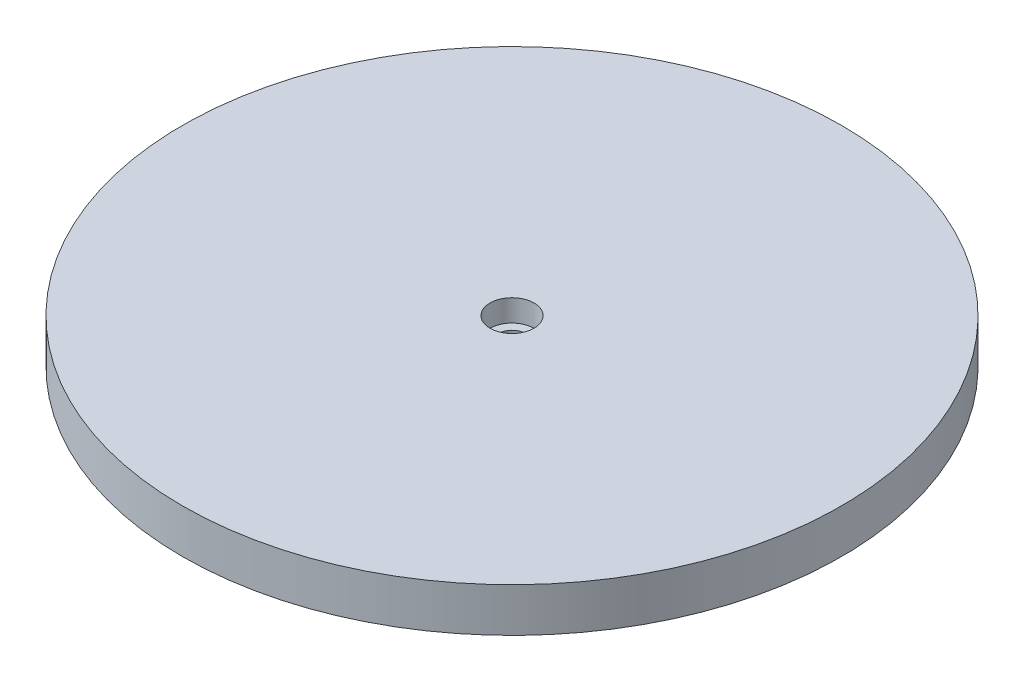
ISO-10303-21;
HEADER;
FILE_DESCRIPTION(('STEP AP214'),'2;1');
FILE_NAME('part.step','',(''),(''),'','','');
FILE_SCHEMA(('AUTOMOTIVE_DESIGN { 1 0 10303 214 1 1 1 1 }'));
ENDSEC;
DATA;
#1=APPLICATION_CONTEXT('core data for automotive mechanical design processes');
#2=APPLICATION_PROTOCOL_DEFINITION('international standard','automotive_design',2000,#1);
#3=PRODUCT_CONTEXT('',#1,'mechanical');
#4=PRODUCT('Part','Part','',(#3));
#5=PRODUCT_RELATED_PRODUCT_CATEGORY('part','',(#4));
#6=PRODUCT_DEFINITION_FORMATION('','',#4);
#7=PRODUCT_DEFINITION_CONTEXT('part definition',#1,'design');
#8=PRODUCT_DEFINITION('design','',#6,#7);
#9=PRODUCT_DEFINITION_SHAPE('','',#8);
#10=(LENGTH_UNIT() NAMED_UNIT(*) SI_UNIT(.MILLI.,.METRE.));
#11=(NAMED_UNIT(*) PLANE_ANGLE_UNIT() SI_UNIT($,.RADIAN.));
#12=(NAMED_UNIT(*) SI_UNIT($,.STERADIAN.) SOLID_ANGLE_UNIT());
#13=UNCERTAINTY_MEASURE_WITH_UNIT(LENGTH_MEASURE(1.E-05),#10,'distance_accuracy_value','');
#14=(GEOMETRIC_REPRESENTATION_CONTEXT(3) GLOBAL_UNCERTAINTY_ASSIGNED_CONTEXT((#13)) GLOBAL_UNIT_ASSIGNED_CONTEXT((#10,
#11,#12)) REPRESENTATION_CONTEXT('',''));
#15=CARTESIAN_POINT('',(0.,0.,0.));
#16=DIRECTION('',(0.,0.,1.));
#17=DIRECTION('',(1.,0.,0.));
#18=AXIS2_PLACEMENT_3D('',#15,#16,#17);
#19=CARTESIAN_POINT('',(0.,0.,0.));
#20=DIRECTION('',(0.,1.,0.));
#21=DIRECTION('',(0.,0.,1.));
#22=AXIS2_PLACEMENT_3D('',#19,#20,#21);
#23=CYLINDRICAL_SURFACE('',#22,0.6);
#24=CARTESIAN_POINT('',(0.,0.,0.));
#25=DIRECTION('',(0.,1.,0.));
#26=DIRECTION('',(0.,0.,1.));
#27=AXIS2_PLACEMENT_3D('',#24,#25,#26);
#28=CIRCLE('',#27,0.6);
#29=CARTESIAN_POINT('',(0.,0.,0.6));
#30=VERTEX_POINT('',#29);
#31=EDGE_CURVE('E50',#30,#30,#28,.T.);
#32=ORIENTED_EDGE('',*,*,#31,.F.);
#33=EDGE_LOOP('',(#32));
#34=FACE_BOUND('',#33,.T.);
#35=CARTESIAN_POINT('',(0.,1.,0.));
#36=DIRECTION('',(0.,1.,0.));
#37=DIRECTION('',(0.,0.,1.));
#38=AXIS2_PLACEMENT_3D('',#35,#36,#37);
#39=CIRCLE('',#38,0.6);
#40=CARTESIAN_POINT('',(0.,1.,0.6));
#41=VERTEX_POINT('',#40);
#42=EDGE_CURVE('E41',#41,#41,#39,.F.);
#43=ORIENTED_EDGE('',*,*,#42,.F.);
#44=EDGE_LOOP('',(#43));
#45=FACE_BOUND('',#44,.T.);
#46=ADVANCED_FACE('F37',(#34,#45),#23,.F.);
#47=CARTESIAN_POINT('',(0.,2.,0.));
#48=DIRECTION('',(0.,-1.,0.));
#49=DIRECTION('',(0.,0.,-1.));
#50=AXIS2_PLACEMENT_3D('',#47,#48,#49);
#51=CYLINDRICAL_SURFACE('',#50,15.);
#52=CARTESIAN_POINT('',(0.,2.,0.));
#53=DIRECTION('',(0.,1.,0.));
#54=DIRECTION('',(0.,0.,1.));
#55=AXIS2_PLACEMENT_3D('',#52,#53,#54);
#56=CIRCLE('',#55,15.);
#57=CARTESIAN_POINT('',(0.,2.,15.));
#58=VERTEX_POINT('',#57);
#59=EDGE_CURVE('E10',#58,#58,#56,.T.);
#60=ORIENTED_EDGE('',*,*,#59,.F.);
#61=EDGE_LOOP('',(#60));
#62=FACE_BOUND('',#61,.T.);
#63=CARTESIAN_POINT('',(0.,0.,0.));
#64=DIRECTION('',(0.,1.,0.));
#65=DIRECTION('',(0.,0.,1.));
#66=AXIS2_PLACEMENT_3D('',#63,#64,#65);
#67=CIRCLE('',#66,15.);
#68=CARTESIAN_POINT('',(0.,0.,15.));
#69=VERTEX_POINT('',#68);
#70=EDGE_CURVE('E45',#69,#69,#67,.T.);
#71=ORIENTED_EDGE('',*,*,#70,.T.);
#72=EDGE_LOOP('',(#71));
#73=FACE_BOUND('',#72,.T.);
#74=ADVANCED_FACE('F39',(#62,#73),#51,.T.);
#75=CARTESIAN_POINT('',(0.,2.,0.));
#76=DIRECTION('',(0.,1.,0.));
#77=DIRECTION('',(0.,0.,1.));
#78=AXIS2_PLACEMENT_3D('',#75,#76,#77);
#79=PLANE('',#78);
#80=CARTESIAN_POINT('',(0.,2.,0.));
#81=DIRECTION('',(0.,1.,0.));
#82=DIRECTION('',(0.,0.,1.));
#83=AXIS2_PLACEMENT_3D('',#80,#81,#82);
#84=CIRCLE('',#83,1.);
#85=CARTESIAN_POINT('',(0.,2.,1.));
#86=VERTEX_POINT('',#85);
#87=EDGE_CURVE('E54',#86,#86,#84,.T.);
#88=ORIENTED_EDGE('',*,*,#87,.F.);
#89=EDGE_LOOP('',(#88));
#90=FACE_BOUND('',#89,.T.);
#91=ORIENTED_EDGE('',*,*,#59,.T.);
#92=EDGE_LOOP('',(#91));
#93=FACE_BOUND('',#92,.T.);
#94=ADVANCED_FACE('F72',(#90,#93),#79,.T.);
#95=CARTESIAN_POINT('',(0.,0.,0.));
#96=DIRECTION('',(0.,1.,0.));
#97=DIRECTION('',(0.,0.,1.));
#98=AXIS2_PLACEMENT_3D('',#95,#96,#97);
#99=PLANE('',#98);
#100=ORIENTED_EDGE('',*,*,#31,.T.);
#101=EDGE_LOOP('',(#100));
#102=FACE_BOUND('',#101,.T.);
#103=ORIENTED_EDGE('',*,*,#70,.F.);
#104=EDGE_LOOP('',(#103));
#105=FACE_BOUND('',#104,.T.);
#106=ADVANCED_FACE('F80',(#102,#105),#99,.F.);
#107=CARTESIAN_POINT('',(0.,1.,0.));
#108=DIRECTION('',(0.,1.,0.));
#109=DIRECTION('',(0.,0.,1.));
#110=AXIS2_PLACEMENT_3D('',#107,#108,#109);
#111=PLANE('',#110);
#112=CARTESIAN_POINT('',(0.,1.,0.));
#113=DIRECTION('',(0.,1.,0.));
#114=DIRECTION('',(0.,0.,1.));
#115=AXIS2_PLACEMENT_3D('',#112,#113,#114);
#116=CIRCLE('',#115,1.);
#117=CARTESIAN_POINT('',(0.,1.,1.));
#118=VERTEX_POINT('',#117);
#119=EDGE_CURVE('E57',#118,#118,#116,.T.);
#120=ORIENTED_EDGE('',*,*,#119,.T.);
#121=EDGE_LOOP('',(#120));
#122=FACE_BOUND('',#121,.T.);
#123=ORIENTED_EDGE('',*,*,#42,.T.);
#124=EDGE_LOOP('',(#123));
#125=FACE_BOUND('',#124,.T.);
#126=ADVANCED_FACE('F64',(#122,#125),#111,.T.);
#127=CARTESIAN_POINT('',(0.,1.,0.));
#128=DIRECTION('',(0.,1.,0.));
#129=DIRECTION('',(0.,0.,1.));
#130=AXIS2_PLACEMENT_3D('',#127,#128,#129);
#131=CYLINDRICAL_SURFACE('',#130,1.);
#132=ORIENTED_EDGE('',*,*,#119,.F.);
#133=EDGE_LOOP('',(#132));
#134=FACE_BOUND('',#133,.T.);
#135=ORIENTED_EDGE('',*,*,#87,.T.);
#136=EDGE_LOOP('',(#135));
#137=FACE_BOUND('',#136,.T.);
#138=ADVANCED_FACE('F77',(#134,#137),#131,.F.);
#139=CLOSED_SHELL('',(#46,#74,#94,#106,#126,#138));
#140=MANIFOLD_SOLID_BREP('B2',#139);
#141=ADVANCED_BREP_SHAPE_REPRESENTATION('',(#18,#140),#14);
#142=SHAPE_DEFINITION_REPRESENTATION(#9,#141);
ENDSEC;
END-ISO-10303-21;
